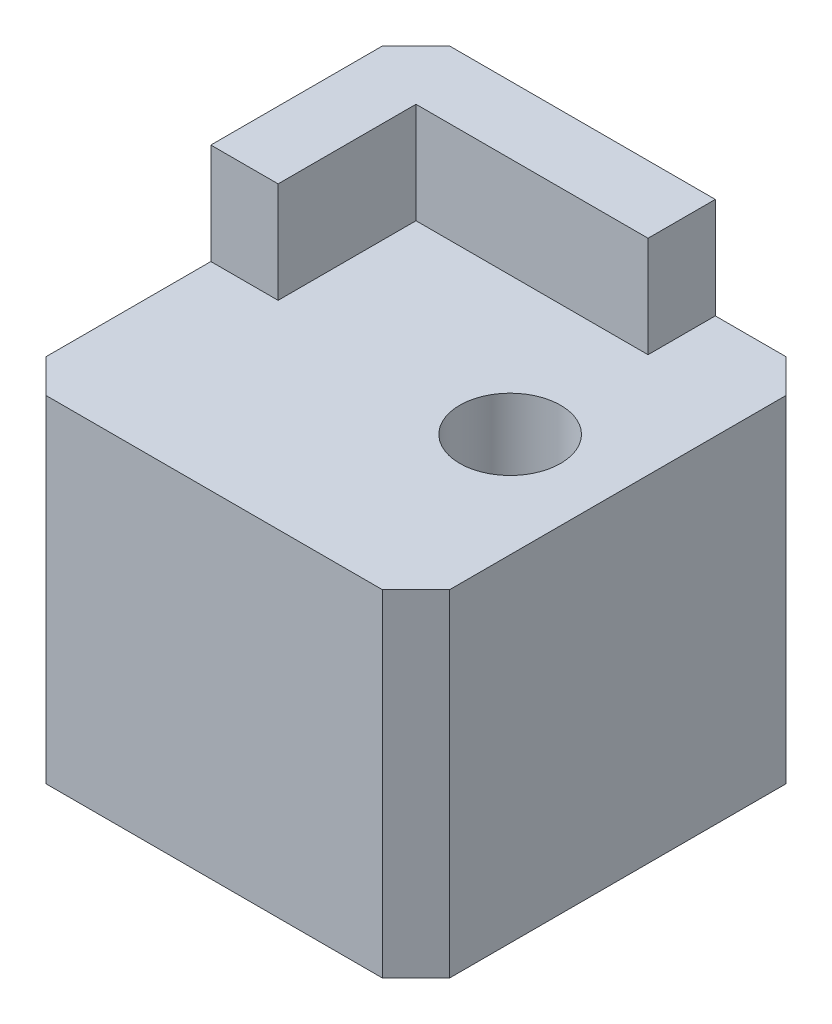
ISO-10303-21;
HEADER;
FILE_DESCRIPTION(('STEP AP214'),'2;1');
FILE_NAME('part.step','',(''),(''),'','','');
FILE_SCHEMA(('AUTOMOTIVE_DESIGN { 1 0 10303 214 1 1 1 1 }'));
ENDSEC;
DATA;
#1=APPLICATION_CONTEXT('core data for automotive mechanical design processes');
#2=APPLICATION_PROTOCOL_DEFINITION('international standard','automotive_design',2000,#1);
#3=PRODUCT_CONTEXT('',#1,'mechanical');
#4=PRODUCT('Part','Part','',(#3));
#5=PRODUCT_RELATED_PRODUCT_CATEGORY('part','',(#4));
#6=PRODUCT_DEFINITION_FORMATION('','',#4);
#7=PRODUCT_DEFINITION_CONTEXT('part definition',#1,'design');
#8=PRODUCT_DEFINITION('design','',#6,#7);
#9=PRODUCT_DEFINITION_SHAPE('','',#8);
#10=(LENGTH_UNIT() NAMED_UNIT(*) SI_UNIT(.MILLI.,.METRE.));
#11=(NAMED_UNIT(*) PLANE_ANGLE_UNIT() SI_UNIT($,.RADIAN.));
#12=(NAMED_UNIT(*) SI_UNIT($,.STERADIAN.) SOLID_ANGLE_UNIT());
#13=UNCERTAINTY_MEASURE_WITH_UNIT(LENGTH_MEASURE(1.E-05),#10,'distance_accuracy_value','');
#14=(GEOMETRIC_REPRESENTATION_CONTEXT(3) GLOBAL_UNCERTAINTY_ASSIGNED_CONTEXT((#13)) GLOBAL_UNIT_ASSIGNED_CONTEXT((#10,
#11,#12)) REPRESENTATION_CONTEXT('',''));
#15=CARTESIAN_POINT('',(0.,0.,0.));
#16=DIRECTION('',(0.,0.,1.));
#17=DIRECTION('',(1.,0.,0.));
#18=AXIS2_PLACEMENT_3D('',#15,#16,#17);
#19=CARTESIAN_POINT('',(0.,0.,0.));
#20=DIRECTION('',(0.,1.,0.));
#21=DIRECTION('',(0.,0.,1.));
#22=AXIS2_PLACEMENT_3D('',#19,#20,#21);
#23=PLANE('',#22);
#24=CARTESIAN_POINT('',(0.,0.,0.));
#25=DIRECTION('',(0.,1.,0.));
#26=DIRECTION('',(0.,0.,1.));
#27=AXIS2_PLACEMENT_3D('',#24,#25,#26);
#28=CIRCLE('',#27,1.5);
#29=CARTESIAN_POINT('',(0.,0.,1.5));
#30=VERTEX_POINT('',#29);
#31=EDGE_CURVE('E187',#30,#30,#28,.T.);
#32=ORIENTED_EDGE('',*,*,#31,.F.);
#33=EDGE_LOOP('',(#32));
#34=FACE_BOUND('',#33,.T.);
#35=DIRECTION('',(0.,0.,1.));
#36=VECTOR('',#35,1.);
#37=CARTESIAN_POINT('',(3.1,0.,-6.1));
#38=LINE('',#37,#36);
#39=CARTESIAN_POINT('',(3.1,0.,-5.1));
#40=VERTEX_POINT('',#39);
#41=CARTESIAN_POINT('',(3.1,0.,4.9));
#42=VERTEX_POINT('',#41);
#43=EDGE_CURVE('E247',#40,#42,#38,.T.);
#44=ORIENTED_EDGE('',*,*,#43,.F.);
#45=DIRECTION('',(0.707106781186549,0.,0.707106781186546));
#46=VECTOR('',#45,1.);
#47=CARTESIAN_POINT('',(4.09999999999999,0.,-4.10000000000001));
#48=LINE('',#47,#46);
#49=CARTESIAN_POINT('',(2.1,0.,-6.1));
#50=VERTEX_POINT('',#49);
#51=EDGE_CURVE('E290',#40,#50,#48,.F.);
#52=ORIENTED_EDGE('',*,*,#51,.T.);
#53=DIRECTION('',(1.,0.,0.));
#54=VECTOR('',#53,1.);
#55=CARTESIAN_POINT('',(-8.9,0.,-6.1));
#56=LINE('',#55,#54);
#57=CARTESIAN_POINT('',(0.,0.,-6.1));
#58=VERTEX_POINT('',#57);
#59=EDGE_CURVE('E229',#58,#50,#56,.T.);
#60=ORIENTED_EDGE('',*,*,#59,.F.);
#61=DIRECTION('',(0.,0.,1.));
#62=VECTOR('',#61,1.);
#63=CARTESIAN_POINT('',(0.,0.,0.));
#64=LINE('',#63,#62);
#65=CARTESIAN_POINT('',(0.,0.,-4.1));
#66=VERTEX_POINT('',#65);
#67=EDGE_CURVE('E169',#58,#66,#64,.T.);
#68=ORIENTED_EDGE('',*,*,#67,.T.);
#69=DIRECTION('',(-1.,0.,0.));
#70=VECTOR('',#69,1.);
#71=CARTESIAN_POINT('',(0.,0.,-4.1));
#72=LINE('',#71,#70);
#73=CARTESIAN_POINT('',(-6.9,0.,-4.1));
#74=VERTEX_POINT('',#73);
#75=EDGE_CURVE('E180',#66,#74,#72,.T.);
#76=ORIENTED_EDGE('',*,*,#75,.T.);
#77=DIRECTION('',(0.,0.,1.));
#78=VECTOR('',#77,1.);
#79=CARTESIAN_POINT('',(-6.9,0.,0.));
#80=LINE('',#79,#78);
#81=CARTESIAN_POINT('',(-6.9,0.,0.));
#82=VERTEX_POINT('',#81);
#83=EDGE_CURVE('E184',#74,#82,#80,.T.);
#84=ORIENTED_EDGE('',*,*,#83,.T.);
#85=DIRECTION('',(-1.,0.,0.));
#86=VECTOR('',#85,1.);
#87=CARTESIAN_POINT('',(0.,0.,0.));
#88=LINE('',#87,#86);
#89=CARTESIAN_POINT('',(-8.9,0.,0.));
#90=VERTEX_POINT('',#89);
#91=EDGE_CURVE('E206',#82,#90,#88,.T.);
#92=ORIENTED_EDGE('',*,*,#91,.T.);
#93=DIRECTION('',(0.,0.,1.));
#94=VECTOR('',#93,1.);
#95=CARTESIAN_POINT('',(-8.9,0.,-6.1));
#96=LINE('',#95,#94);
#97=CARTESIAN_POINT('',(-8.9,0.,4.9));
#98=VERTEX_POINT('',#97);
#99=EDGE_CURVE('E172',#90,#98,#96,.T.);
#100=ORIENTED_EDGE('',*,*,#99,.T.);
#101=DIRECTION('',(-0.707106781186548,0.,-0.707106781186547));
#102=VECTOR('',#101,1.);
#103=CARTESIAN_POINT('',(-6.89999999999999,0.,6.90000000000001));
#104=LINE('',#103,#102);
#105=CARTESIAN_POINT('',(-7.9,0.,5.9));
#106=VERTEX_POINT('',#105);
#107=EDGE_CURVE('E76',#98,#106,#104,.F.);
#108=ORIENTED_EDGE('',*,*,#107,.T.);
#109=DIRECTION('',(1.,0.,0.));
#110=VECTOR('',#109,1.);
#111=CARTESIAN_POINT('',(-8.9,0.,5.9));
#112=LINE('',#111,#110);
#113=CARTESIAN_POINT('',(2.1,0.,5.9));
#114=VERTEX_POINT('',#113);
#115=EDGE_CURVE('E244',#106,#114,#112,.T.);
#116=ORIENTED_EDGE('',*,*,#115,.T.);
#117=DIRECTION('',(0.707106781186546,0.,-0.707106781186549));
#118=VECTOR('',#117,1.);
#119=CARTESIAN_POINT('',(4.00000000000001,0.,3.99999999999999));
#120=LINE('',#119,#118);
#121=EDGE_CURVE('E68',#114,#42,#120,.T.);
#122=ORIENTED_EDGE('',*,*,#121,.T.);
#123=EDGE_LOOP('',(#44,#52,#60,#68,#76,#84,#92,#100,#108,#116,#122));
#124=FACE_BOUND('',#123,.T.);
#125=ADVANCED_FACE('F51',(#34,#124),#23,.T.);
#126=CARTESIAN_POINT('',(-8.9,-10.,-6.1));
#127=DIRECTION('',(-1.,0.,0.));
#128=DIRECTION('',(0.,0.,1.));
#129=AXIS2_PLACEMENT_3D('',#126,#127,#128);
#130=PLANE('',#129);
#131=DIRECTION('',(0.,0.,-1.));
#132=VECTOR('',#131,1.);
#133=CARTESIAN_POINT('',(-8.9,3.,0.));
#134=LINE('',#133,#132);
#135=CARTESIAN_POINT('',(-8.9,3.,0.));
#136=VERTEX_POINT('',#135);
#137=CARTESIAN_POINT('',(-8.9,3.,-5.09999999999999));
#138=VERTEX_POINT('',#137);
#139=EDGE_CURVE('E161',#136,#138,#134,.T.);
#140=ORIENTED_EDGE('',*,*,#139,.T.);
#141=DIRECTION('',(0.,-1.,0.));
#142=VECTOR('',#141,1.);
#143=CARTESIAN_POINT('',(-8.9,-10.,-5.09999999999999));
#144=LINE('',#143,#142);
#145=CARTESIAN_POINT('',(-8.9,-10.,-5.09999999999999));
#146=VERTEX_POINT('',#145);
#147=EDGE_CURVE('E264',#138,#146,#144,.T.);
#148=ORIENTED_EDGE('',*,*,#147,.T.);
#149=DIRECTION('',(0.,0.,1.));
#150=VECTOR('',#149,1.);
#151=CARTESIAN_POINT('',(-8.9,-10.,-6.1));
#152=LINE('',#151,#150);
#153=CARTESIAN_POINT('',(-8.9,-10.,4.9));
#154=VERTEX_POINT('',#153);
#155=EDGE_CURVE('E224',#146,#154,#152,.T.);
#156=ORIENTED_EDGE('',*,*,#155,.T.);
#157=DIRECTION('',(0.,1.,0.));
#158=VECTOR('',#157,1.);
#159=CARTESIAN_POINT('',(-8.9,-10.,4.9));
#160=LINE('',#159,#158);
#161=EDGE_CURVE('E260',#154,#98,#160,.T.);
#162=ORIENTED_EDGE('',*,*,#161,.T.);
#163=ORIENTED_EDGE('',*,*,#99,.F.);
#164=DIRECTION('',(0.,-1.,0.));
#165=VECTOR('',#164,1.);
#166=CARTESIAN_POINT('',(-8.9,3.,0.));
#167=LINE('',#166,#165);
#168=EDGE_CURVE('E173',#136,#90,#167,.T.);
#169=ORIENTED_EDGE('',*,*,#168,.F.);
#170=EDGE_LOOP('',(#140,#148,#156,#162,#163,#169));
#171=FACE_BOUND('',#170,.T.);
#172=ADVANCED_FACE('F318',(#171),#130,.T.);
#173=CARTESIAN_POINT('',(-8.9,-10.,-6.1));
#174=DIRECTION('',(0.,0.,1.));
#175=DIRECTION('',(1.,0.,0.));
#176=AXIS2_PLACEMENT_3D('',#173,#174,#175);
#177=PLANE('',#176);
#178=DIRECTION('',(1.,0.,0.));
#179=VECTOR('',#178,1.);
#180=CARTESIAN_POINT('',(-8.9,-10.,-6.1));
#181=LINE('',#180,#179);
#182=CARTESIAN_POINT('',(-7.9,-10.,-6.1));
#183=VERTEX_POINT('',#182);
#184=CARTESIAN_POINT('',(2.1,-10.,-6.1));
#185=VERTEX_POINT('',#184);
#186=EDGE_CURVE('E237',#183,#185,#181,.T.);
#187=ORIENTED_EDGE('',*,*,#186,.F.);
#188=DIRECTION('',(0.,1.,0.));
#189=VECTOR('',#188,1.);
#190=CARTESIAN_POINT('',(-7.9,3.,-6.1));
#191=LINE('',#190,#189);
#192=CARTESIAN_POINT('',(-7.9,3.,-6.1));
#193=VERTEX_POINT('',#192);
#194=EDGE_CURVE('E157',#183,#193,#191,.T.);
#195=ORIENTED_EDGE('',*,*,#194,.T.);
#196=DIRECTION('',(1.,0.,0.));
#197=VECTOR('',#196,1.);
#198=CARTESIAN_POINT('',(0.,3.,-6.1));
#199=LINE('',#198,#197);
#200=CARTESIAN_POINT('',(0.,3.,-6.1));
#201=VERTEX_POINT('',#200);
#202=EDGE_CURVE('E149',#193,#201,#199,.T.);
#203=ORIENTED_EDGE('',*,*,#202,.T.);
#204=DIRECTION('',(0.,-1.,0.));
#205=VECTOR('',#204,1.);
#206=CARTESIAN_POINT('',(0.,3.,-6.1));
#207=LINE('',#206,#205);
#208=EDGE_CURVE('E154',#201,#58,#207,.T.);
#209=ORIENTED_EDGE('',*,*,#208,.T.);
#210=ORIENTED_EDGE('',*,*,#59,.T.);
#211=DIRECTION('',(0.,-1.,0.));
#212=VECTOR('',#211,1.);
#213=CARTESIAN_POINT('',(2.1,-10.,-6.1));
#214=LINE('',#213,#212);
#215=EDGE_CURVE('E241',#50,#185,#214,.T.);
#216=ORIENTED_EDGE('',*,*,#215,.T.);
#217=EDGE_LOOP('',(#187,#195,#203,#209,#210,#216));
#218=FACE_BOUND('',#217,.T.);
#219=ADVANCED_FACE('F152',(#218),#177,.F.);
#220=CARTESIAN_POINT('',(3.1,-10.,-6.1));
#221=DIRECTION('',(-1.,0.,0.));
#222=DIRECTION('',(0.,0.,1.));
#223=AXIS2_PLACEMENT_3D('',#220,#221,#222);
#224=PLANE('',#223);
#225=DIRECTION('',(0.,0.,1.));
#226=VECTOR('',#225,1.);
#227=CARTESIAN_POINT('',(3.1,-10.,-6.1));
#228=LINE('',#227,#226);
#229=CARTESIAN_POINT('',(3.1,-10.,-5.1));
#230=VERTEX_POINT('',#229);
#231=CARTESIAN_POINT('',(3.1,-10.,4.9));
#232=VERTEX_POINT('',#231);
#233=EDGE_CURVE('E233',#230,#232,#228,.T.);
#234=ORIENTED_EDGE('',*,*,#233,.F.);
#235=DIRECTION('',(0.,1.,0.));
#236=VECTOR('',#235,1.);
#237=CARTESIAN_POINT('',(3.1,-10.,-5.1));
#238=LINE('',#237,#236);
#239=EDGE_CURVE('E282',#230,#40,#238,.T.);
#240=ORIENTED_EDGE('',*,*,#239,.T.);
#241=ORIENTED_EDGE('',*,*,#43,.T.);
#242=DIRECTION('',(0.,-1.,0.));
#243=VECTOR('',#242,1.);
#244=CARTESIAN_POINT('',(3.1,-10.,4.9));
#245=LINE('',#244,#243);
#246=EDGE_CURVE('E279',#42,#232,#245,.T.);
#247=ORIENTED_EDGE('',*,*,#246,.T.);
#248=EDGE_LOOP('',(#234,#240,#241,#247));
#249=FACE_BOUND('',#248,.T.);
#250=ADVANCED_FACE('F301',(#249),#224,.F.);
#251=CARTESIAN_POINT('',(-8.9,-10.,5.9));
#252=DIRECTION('',(0.,0.,1.));
#253=DIRECTION('',(1.,0.,0.));
#254=AXIS2_PLACEMENT_3D('',#251,#252,#253);
#255=PLANE('',#254);
#256=ORIENTED_EDGE('',*,*,#115,.F.);
#257=DIRECTION('',(0.,-1.,0.));
#258=VECTOR('',#257,1.);
#259=CARTESIAN_POINT('',(-7.9,-10.,5.9));
#260=LINE('',#259,#258);
#261=CARTESIAN_POINT('',(-7.9,-10.,5.9));
#262=VERTEX_POINT('',#261);
#263=EDGE_CURVE('E11',#106,#262,#260,.T.);
#264=ORIENTED_EDGE('',*,*,#263,.T.);
#265=DIRECTION('',(1.,0.,0.));
#266=VECTOR('',#265,1.);
#267=CARTESIAN_POINT('',(-8.9,-10.,5.9));
#268=LINE('',#267,#266);
#269=CARTESIAN_POINT('',(2.1,-10.,5.9));
#270=VERTEX_POINT('',#269);
#271=EDGE_CURVE('E228',#262,#270,#268,.T.);
#272=ORIENTED_EDGE('',*,*,#271,.T.);
#273=DIRECTION('',(0.,1.,0.));
#274=VECTOR('',#273,1.);
#275=CARTESIAN_POINT('',(2.1,0.,5.9));
#276=LINE('',#275,#274);
#277=EDGE_CURVE('E61',#270,#114,#276,.T.);
#278=ORIENTED_EDGE('',*,*,#277,.T.);
#279=EDGE_LOOP('',(#256,#264,#272,#278));
#280=FACE_BOUND('',#279,.T.);
#281=ADVANCED_FACE('F294',(#280),#255,.T.);
#282=CARTESIAN_POINT('',(0.,-10.,0.));
#283=DIRECTION('',(0.,1.,0.));
#284=DIRECTION('',(0.,0.,1.));
#285=AXIS2_PLACEMENT_3D('',#282,#283,#284);
#286=PLANE('',#285);
#287=CARTESIAN_POINT('',(0.,-10.,0.));
#288=DIRECTION('',(0.,1.,0.));
#289=DIRECTION('',(0.,0.,1.));
#290=AXIS2_PLACEMENT_3D('',#287,#288,#289);
#291=CIRCLE('',#290,1.5);
#292=CARTESIAN_POINT('',(0.,-10.,1.5));
#293=VERTEX_POINT('',#292);
#294=EDGE_CURVE('E207',#293,#293,#291,.T.);
#295=ORIENTED_EDGE('',*,*,#294,.T.);
#296=EDGE_LOOP('',(#295));
#297=FACE_BOUND('',#296,.T.);
#298=ORIENTED_EDGE('',*,*,#155,.F.);
#299=DIRECTION('',(0.707106781186546,0.,-0.707106781186549));
#300=VECTOR('',#299,1.);
#301=CARTESIAN_POINT('',(-7.9,-10.,-6.1));
#302=LINE('',#301,#300);
#303=EDGE_CURVE('E276',#146,#183,#302,.T.);
#304=ORIENTED_EDGE('',*,*,#303,.T.);
#305=ORIENTED_EDGE('',*,*,#186,.T.);
#306=DIRECTION('',(-0.707106781186549,0.,-0.707106781186546));
#307=VECTOR('',#306,1.);
#308=CARTESIAN_POINT('',(3.1,-10.,-5.1));
#309=LINE('',#308,#307);
#310=EDGE_CURVE('E273',#185,#230,#309,.F.);
#311=ORIENTED_EDGE('',*,*,#310,.T.);
#312=ORIENTED_EDGE('',*,*,#233,.T.);
#313=DIRECTION('',(-0.707106781186546,0.,0.707106781186549));
#314=VECTOR('',#313,1.);
#315=CARTESIAN_POINT('',(2.1,-10.,5.9));
#316=LINE('',#315,#314);
#317=EDGE_CURVE('E267',#232,#270,#316,.T.);
#318=ORIENTED_EDGE('',*,*,#317,.T.);
#319=ORIENTED_EDGE('',*,*,#271,.F.);
#320=DIRECTION('',(0.707106781186548,0.,0.707106781186547));
#321=VECTOR('',#320,1.);
#322=CARTESIAN_POINT('',(-8.9,-10.,4.9));
#323=LINE('',#322,#321);
#324=EDGE_CURVE('E270',#262,#154,#323,.F.);
#325=ORIENTED_EDGE('',*,*,#324,.T.);
#326=EDGE_LOOP('',(#298,#304,#305,#311,#312,#318,#319,#325));
#327=FACE_BOUND('',#326,.T.);
#328=ADVANCED_FACE('F305',(#297,#327),#286,.F.);
#329=CARTESIAN_POINT('',(0.,3.,0.));
#330=DIRECTION('',(1.,0.,0.));
#331=DIRECTION('',(0.,0.,-1.));
#332=AXIS2_PLACEMENT_3D('',#329,#330,#331);
#333=PLANE('',#332);
#334=ORIENTED_EDGE('',*,*,#67,.F.);
#335=ORIENTED_EDGE('',*,*,#208,.F.);
#336=DIRECTION('',(0.,0.,1.));
#337=VECTOR('',#336,1.);
#338=CARTESIAN_POINT('',(0.,3.,0.));
#339=LINE('',#338,#337);
#340=CARTESIAN_POINT('',(0.,3.,-4.1));
#341=VERTEX_POINT('',#340);
#342=EDGE_CURVE('E162',#201,#341,#339,.T.);
#343=ORIENTED_EDGE('',*,*,#342,.T.);
#344=DIRECTION('',(0.,-1.,0.));
#345=VECTOR('',#344,1.);
#346=CARTESIAN_POINT('',(0.,3.,-4.1));
#347=LINE('',#346,#345);
#348=EDGE_CURVE('E203',#341,#66,#347,.T.);
#349=ORIENTED_EDGE('',*,*,#348,.T.);
#350=EDGE_LOOP('',(#334,#335,#343,#349));
#351=FACE_BOUND('',#350,.T.);
#352=ADVANCED_FACE('F166',(#351),#333,.T.);
#353=CARTESIAN_POINT('',(0.,3.,0.));
#354=DIRECTION('',(0.,0.,1.));
#355=DIRECTION('',(1.,0.,0.));
#356=AXIS2_PLACEMENT_3D('',#353,#354,#355);
#357=PLANE('',#356);
#358=ORIENTED_EDGE('',*,*,#91,.F.);
#359=DIRECTION('',(0.,-1.,0.));
#360=VECTOR('',#359,1.);
#361=CARTESIAN_POINT('',(-6.9,3.,0.));
#362=LINE('',#361,#360);
#363=CARTESIAN_POINT('',(-6.9,3.,0.));
#364=VERTEX_POINT('',#363);
#365=EDGE_CURVE('E219',#364,#82,#362,.T.);
#366=ORIENTED_EDGE('',*,*,#365,.F.);
#367=DIRECTION('',(-1.,0.,0.));
#368=VECTOR('',#367,1.);
#369=CARTESIAN_POINT('',(0.,3.,0.));
#370=LINE('',#369,#368);
#371=EDGE_CURVE('E193',#364,#136,#370,.T.);
#372=ORIENTED_EDGE('',*,*,#371,.T.);
#373=ORIENTED_EDGE('',*,*,#168,.T.);
#374=EDGE_LOOP('',(#358,#366,#372,#373));
#375=FACE_BOUND('',#374,.T.);
#376=ADVANCED_FACE('F322',(#375),#357,.T.);
#377=CARTESIAN_POINT('',(-6.9,3.,0.));
#378=DIRECTION('',(1.,0.,0.));
#379=DIRECTION('',(0.,0.,-1.));
#380=AXIS2_PLACEMENT_3D('',#377,#378,#379);
#381=PLANE('',#380);
#382=ORIENTED_EDGE('',*,*,#83,.F.);
#383=DIRECTION('',(0.,-1.,0.));
#384=VECTOR('',#383,1.);
#385=CARTESIAN_POINT('',(-6.9,3.,-4.1));
#386=LINE('',#385,#384);
#387=CARTESIAN_POINT('',(-6.9,3.,-4.1));
#388=VERTEX_POINT('',#387);
#389=EDGE_CURVE('E216',#388,#74,#386,.T.);
#390=ORIENTED_EDGE('',*,*,#389,.F.);
#391=DIRECTION('',(0.,0.,1.));
#392=VECTOR('',#391,1.);
#393=CARTESIAN_POINT('',(-6.9,3.,0.));
#394=LINE('',#393,#392);
#395=EDGE_CURVE('E197',#388,#364,#394,.T.);
#396=ORIENTED_EDGE('',*,*,#395,.T.);
#397=ORIENTED_EDGE('',*,*,#365,.T.);
#398=EDGE_LOOP('',(#382,#390,#396,#397));
#399=FACE_BOUND('',#398,.T.);
#400=ADVANCED_FACE('F326',(#399),#381,.T.);
#401=CARTESIAN_POINT('',(0.,3.,-4.1));
#402=DIRECTION('',(0.,0.,1.));
#403=DIRECTION('',(1.,0.,0.));
#404=AXIS2_PLACEMENT_3D('',#401,#402,#403);
#405=PLANE('',#404);
#406=ORIENTED_EDGE('',*,*,#75,.F.);
#407=ORIENTED_EDGE('',*,*,#348,.F.);
#408=DIRECTION('',(-1.,0.,0.));
#409=VECTOR('',#408,1.);
#410=CARTESIAN_POINT('',(0.,3.,-4.1));
#411=LINE('',#410,#409);
#412=EDGE_CURVE('E178',#341,#388,#411,.T.);
#413=ORIENTED_EDGE('',*,*,#412,.T.);
#414=ORIENTED_EDGE('',*,*,#389,.T.);
#415=EDGE_LOOP('',(#406,#407,#413,#414));
#416=FACE_BOUND('',#415,.T.);
#417=ADVANCED_FACE('F328',(#416),#405,.T.);
#418=CARTESIAN_POINT('',(0.,3.,0.));
#419=DIRECTION('',(0.,1.,0.));
#420=DIRECTION('',(0.,0.,1.));
#421=AXIS2_PLACEMENT_3D('',#418,#419,#420);
#422=PLANE('',#421);
#423=ORIENTED_EDGE('',*,*,#202,.F.);
#424=DIRECTION('',(-0.707106781186546,0.,0.707106781186549));
#425=VECTOR('',#424,1.);
#426=CARTESIAN_POINT('',(-7.00000000000002,3.,-6.99999999999999));
#427=LINE('',#426,#425);
#428=EDGE_CURVE('E257',#193,#138,#427,.T.);
#429=ORIENTED_EDGE('',*,*,#428,.T.);
#430=ORIENTED_EDGE('',*,*,#139,.F.);
#431=ORIENTED_EDGE('',*,*,#371,.F.);
#432=ORIENTED_EDGE('',*,*,#395,.F.);
#433=ORIENTED_EDGE('',*,*,#412,.F.);
#434=ORIENTED_EDGE('',*,*,#342,.F.);
#435=EDGE_LOOP('',(#423,#429,#430,#431,#432,#433,#434));
#436=FACE_BOUND('',#435,.T.);
#437=ADVANCED_FACE('F175',(#436),#422,.T.);
#438=CARTESIAN_POINT('',(-7.9,-10.,-6.1));
#439=DIRECTION('',(-0.707106781186549,0.,-0.707106781186546));
#440=DIRECTION('',(0.,-1.,0.));
#441=AXIS2_PLACEMENT_3D('',#438,#439,#440);
#442=PLANE('',#441);
#443=ORIENTED_EDGE('',*,*,#303,.F.);
#444=ORIENTED_EDGE('',*,*,#147,.F.);
#445=ORIENTED_EDGE('',*,*,#428,.F.);
#446=ORIENTED_EDGE('',*,*,#194,.F.);
#447=EDGE_LOOP('',(#443,#444,#445,#446));
#448=FACE_BOUND('',#447,.T.);
#449=ADVANCED_FACE('F314',(#448),#442,.T.);
#450=CARTESIAN_POINT('',(3.1,-10.,-5.1));
#451=DIRECTION('',(-0.707106781186546,0.,0.707106781186549));
#452=DIRECTION('',(0.,1.,0.));
#453=AXIS2_PLACEMENT_3D('',#450,#451,#452);
#454=PLANE('',#453);
#455=ORIENTED_EDGE('',*,*,#310,.F.);
#456=ORIENTED_EDGE('',*,*,#215,.F.);
#457=ORIENTED_EDGE('',*,*,#51,.F.);
#458=ORIENTED_EDGE('',*,*,#239,.F.);
#459=EDGE_LOOP('',(#455,#456,#457,#458));
#460=FACE_BOUND('',#459,.T.);
#461=ADVANCED_FACE('F309',(#460),#454,.F.);
#462=CARTESIAN_POINT('',(-8.9,-10.,4.9));
#463=DIRECTION('',(0.707106781186547,0.,-0.707106781186548));
#464=DIRECTION('',(0.,1.,0.));
#465=AXIS2_PLACEMENT_3D('',#462,#463,#464);
#466=PLANE('',#465);
#467=ORIENTED_EDGE('',*,*,#324,.F.);
#468=ORIENTED_EDGE('',*,*,#263,.F.);
#469=ORIENTED_EDGE('',*,*,#107,.F.);
#470=ORIENTED_EDGE('',*,*,#161,.F.);
#471=EDGE_LOOP('',(#467,#468,#469,#470));
#472=FACE_BOUND('',#471,.T.);
#473=ADVANCED_FACE('F364',(#472),#466,.F.);
#474=CARTESIAN_POINT('',(2.1,-10.,5.9));
#475=DIRECTION('',(0.707106781186549,0.,0.707106781186546));
#476=DIRECTION('',(0.,-1.,0.));
#477=AXIS2_PLACEMENT_3D('',#474,#475,#476);
#478=PLANE('',#477);
#479=ORIENTED_EDGE('',*,*,#317,.F.);
#480=ORIENTED_EDGE('',*,*,#246,.F.);
#481=ORIENTED_EDGE('',*,*,#121,.F.);
#482=ORIENTED_EDGE('',*,*,#277,.F.);
#483=EDGE_LOOP('',(#479,#480,#481,#482));
#484=FACE_BOUND('',#483,.T.);
#485=ADVANCED_FACE('F54',(#484),#478,.T.);
#486=CARTESIAN_POINT('',(0.,-10.,0.));
#487=DIRECTION('',(0.,1.,0.));
#488=DIRECTION('',(0.,0.,1.));
#489=AXIS2_PLACEMENT_3D('',#486,#487,#488);
#490=CYLINDRICAL_SURFACE('',#489,1.5);
#491=ORIENTED_EDGE('',*,*,#294,.F.);
#492=EDGE_LOOP('',(#491));
#493=FACE_BOUND('',#492,.T.);
#494=ORIENTED_EDGE('',*,*,#31,.T.);
#495=EDGE_LOOP('',(#494));
#496=FACE_BOUND('',#495,.T.);
#497=ADVANCED_FACE('F372',(#493,#496),#490,.F.);
#498=CLOSED_SHELL('',(#125,#172,#219,#250,#281,#328,#352,#376,#400,#417,#437,#449,#461,#473,
#485,#497));
#499=MANIFOLD_SOLID_BREP('B2',#498);
#500=ADVANCED_BREP_SHAPE_REPRESENTATION('',(#18,#499),#14);
#501=SHAPE_DEFINITION_REPRESENTATION(#9,#500);
ENDSEC;
END-ISO-10303-21;
